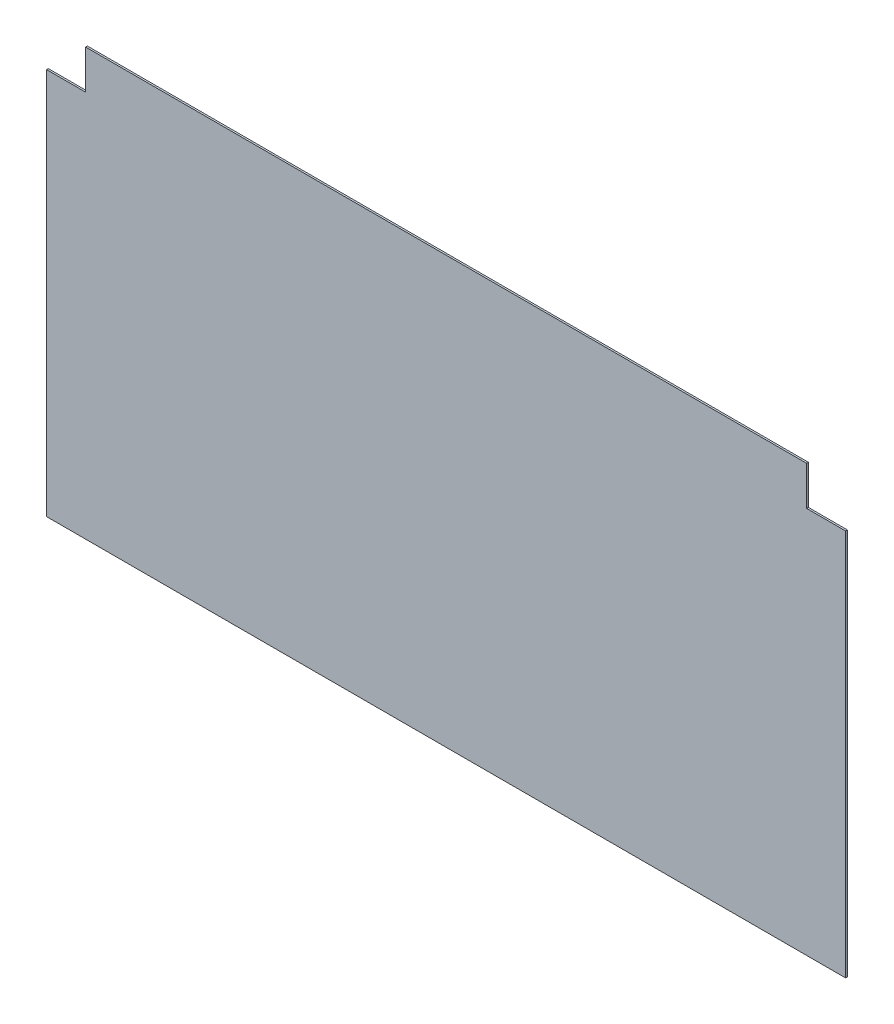
ISO-10303-21;
HEADER;
FILE_DESCRIPTION(('STEP AP214'),'2;1');
FILE_NAME('part.step','',(''),(''),'','','');
FILE_SCHEMA(('AUTOMOTIVE_DESIGN { 1 0 10303 214 1 1 1 1 }'));
ENDSEC;
DATA;
#1=APPLICATION_CONTEXT('core data for automotive mechanical design processes');
#2=APPLICATION_PROTOCOL_DEFINITION('international standard','automotive_design',2000,#1);
#3=PRODUCT_CONTEXT('',#1,'mechanical');
#4=PRODUCT('Part','Part','',(#3));
#5=PRODUCT_RELATED_PRODUCT_CATEGORY('part','',(#4));
#6=PRODUCT_DEFINITION_FORMATION('','',#4);
#7=PRODUCT_DEFINITION_CONTEXT('part definition',#1,'design');
#8=PRODUCT_DEFINITION('design','',#6,#7);
#9=PRODUCT_DEFINITION_SHAPE('','',#8);
#10=(LENGTH_UNIT() NAMED_UNIT(*) SI_UNIT(.MILLI.,.METRE.));
#11=(NAMED_UNIT(*) PLANE_ANGLE_UNIT() SI_UNIT($,.RADIAN.));
#12=(NAMED_UNIT(*) SI_UNIT($,.STERADIAN.) SOLID_ANGLE_UNIT());
#13=UNCERTAINTY_MEASURE_WITH_UNIT(LENGTH_MEASURE(1.E-05),#10,'distance_accuracy_value','');
#14=(GEOMETRIC_REPRESENTATION_CONTEXT(3) GLOBAL_UNCERTAINTY_ASSIGNED_CONTEXT((#13)) GLOBAL_UNIT_ASSIGNED_CONTEXT((#10,
#11,#12)) REPRESENTATION_CONTEXT('',''));
#15=CARTESIAN_POINT('',(0.,0.,0.));
#16=DIRECTION('',(0.,0.,1.));
#17=DIRECTION('',(1.,0.,0.));
#18=AXIS2_PLACEMENT_3D('',#15,#16,#17);
#19=CARTESIAN_POINT('',(225.,120.,1.));
#20=DIRECTION('',(-1.,0.,0.));
#21=DIRECTION('',(0.,-1.,0.));
#22=AXIS2_PLACEMENT_3D('',#19,#20,#21);
#23=PLANE('',#22);
#24=DIRECTION('',(0.,1.,0.));
#25=VECTOR('',#24,1.);
#26=CARTESIAN_POINT('',(225.,120.,0.));
#27=LINE('',#26,#25);
#28=CARTESIAN_POINT('',(225.,-120.,0.));
#29=VERTEX_POINT('',#28);
#30=CARTESIAN_POINT('',(225.,97.9999999999999,0.));
#31=VERTEX_POINT('',#30);
#32=EDGE_CURVE('E143',#29,#31,#27,.T.);
#33=ORIENTED_EDGE('',*,*,#32,.T.);
#34=DIRECTION('',(0.,0.,1.));
#35=VECTOR('',#34,1.);
#36=CARTESIAN_POINT('',(225.,97.9999999999999,-9.));
#37=LINE('',#36,#35);
#38=CARTESIAN_POINT('',(225.,97.9999999999999,1.));
#39=VERTEX_POINT('',#38);
#40=EDGE_CURVE('E193',#31,#39,#37,.T.);
#41=ORIENTED_EDGE('',*,*,#40,.T.);
#42=DIRECTION('',(0.,1.,0.));
#43=VECTOR('',#42,1.);
#44=CARTESIAN_POINT('',(225.,120.,1.));
#45=LINE('',#44,#43);
#46=CARTESIAN_POINT('',(225.,-120.,1.));
#47=VERTEX_POINT('',#46);
#48=EDGE_CURVE('E139',#47,#39,#45,.T.);
#49=ORIENTED_EDGE('',*,*,#48,.F.);
#50=DIRECTION('',(0.,0.,-1.));
#51=VECTOR('',#50,1.);
#52=CARTESIAN_POINT('',(225.,-120.,1.));
#53=LINE('',#52,#51);
#54=EDGE_CURVE('E137',#47,#29,#53,.T.);
#55=ORIENTED_EDGE('',*,*,#54,.T.);
#56=EDGE_LOOP('',(#33,#41,#49,#55));
#57=FACE_BOUND('',#56,.T.);
#58=ADVANCED_FACE('F44',(#57),#23,.F.);
#59=CARTESIAN_POINT('',(-225.,120.,1.));
#60=DIRECTION('',(0.,-1.,0.));
#61=DIRECTION('',(0.,0.,-1.));
#62=AXIS2_PLACEMENT_3D('',#59,#60,#61);
#63=PLANE('',#62);
#64=DIRECTION('',(-1.,0.,0.));
#65=VECTOR('',#64,1.);
#66=CARTESIAN_POINT('',(-225.,120.,0.));
#67=LINE('',#66,#65);
#68=CARTESIAN_POINT('',(203.,120.,0.));
#69=VERTEX_POINT('',#68);
#70=CARTESIAN_POINT('',(-203.,120.,0.));
#71=VERTEX_POINT('',#70);
#72=EDGE_CURVE('E147',#69,#71,#67,.T.);
#73=ORIENTED_EDGE('',*,*,#72,.T.);
#74=DIRECTION('',(0.,0.,1.));
#75=VECTOR('',#74,1.);
#76=CARTESIAN_POINT('',(-203.,120.,-9.));
#77=LINE('',#76,#75);
#78=CARTESIAN_POINT('',(-203.,120.,1.));
#79=VERTEX_POINT('',#78);
#80=EDGE_CURVE('E148',#71,#79,#77,.T.);
#81=ORIENTED_EDGE('',*,*,#80,.T.);
#82=DIRECTION('',(-1.,0.,0.));
#83=VECTOR('',#82,1.);
#84=CARTESIAN_POINT('',(-225.,120.,1.));
#85=LINE('',#84,#83);
#86=CARTESIAN_POINT('',(203.,120.,1.));
#87=VERTEX_POINT('',#86);
#88=EDGE_CURVE('E133',#87,#79,#85,.T.);
#89=ORIENTED_EDGE('',*,*,#88,.F.);
#90=DIRECTION('',(0.,0.,1.));
#91=VECTOR('',#90,1.);
#92=CARTESIAN_POINT('',(203.,120.,-9.));
#93=LINE('',#92,#91);
#94=EDGE_CURVE('E192',#69,#87,#93,.T.);
#95=ORIENTED_EDGE('',*,*,#94,.F.);
#96=EDGE_LOOP('',(#73,#81,#89,#95));
#97=FACE_BOUND('',#96,.T.);
#98=ADVANCED_FACE('F210',(#97),#63,.F.);
#99=CARTESIAN_POINT('',(-225.,120.,1.));
#100=DIRECTION('',(1.,0.,0.));
#101=DIRECTION('',(0.,1.,0.));
#102=AXIS2_PLACEMENT_3D('',#99,#100,#101);
#103=PLANE('',#102);
#104=DIRECTION('',(0.,-1.,0.));
#105=VECTOR('',#104,1.);
#106=CARTESIAN_POINT('',(-225.,120.,1.));
#107=LINE('',#106,#105);
#108=CARTESIAN_POINT('',(-225.,97.9999999999999,1.));
#109=VERTEX_POINT('',#108);
#110=CARTESIAN_POINT('',(-225.,-120.,1.));
#111=VERTEX_POINT('',#110);
#112=EDGE_CURVE('E121',#109,#111,#107,.T.);
#113=ORIENTED_EDGE('',*,*,#112,.F.);
#114=DIRECTION('',(0.,0.,1.));
#115=VECTOR('',#114,1.);
#116=CARTESIAN_POINT('',(-225.,97.9999999999999,-9.));
#117=LINE('',#116,#115);
#118=CARTESIAN_POINT('',(-225.,97.9999999999999,0.));
#119=VERTEX_POINT('',#118);
#120=EDGE_CURVE('E107',#119,#109,#117,.T.);
#121=ORIENTED_EDGE('',*,*,#120,.F.);
#122=DIRECTION('',(0.,-1.,0.));
#123=VECTOR('',#122,1.);
#124=CARTESIAN_POINT('',(-225.,120.,0.));
#125=LINE('',#124,#123);
#126=CARTESIAN_POINT('',(-225.,-120.,0.));
#127=VERTEX_POINT('',#126);
#128=EDGE_CURVE('E152',#119,#127,#125,.T.);
#129=ORIENTED_EDGE('',*,*,#128,.T.);
#130=DIRECTION('',(0.,0.,-1.));
#131=VECTOR('',#130,1.);
#132=CARTESIAN_POINT('',(-225.,-120.,1.));
#133=LINE('',#132,#131);
#134=EDGE_CURVE('E129',#111,#127,#133,.T.);
#135=ORIENTED_EDGE('',*,*,#134,.F.);
#136=EDGE_LOOP('',(#113,#121,#129,#135));
#137=FACE_BOUND('',#136,.T.);
#138=ADVANCED_FACE('F127',(#137),#103,.F.);
#139=CARTESIAN_POINT('',(-225.,-120.,1.));
#140=DIRECTION('',(0.,1.,0.));
#141=DIRECTION('',(0.,0.,1.));
#142=AXIS2_PLACEMENT_3D('',#139,#140,#141);
#143=PLANE('',#142);
#144=DIRECTION('',(1.,0.,0.));
#145=VECTOR('',#144,1.);
#146=CARTESIAN_POINT('',(-225.,-120.,0.));
#147=LINE('',#146,#145);
#148=EDGE_CURVE('E155',#127,#29,#147,.T.);
#149=ORIENTED_EDGE('',*,*,#148,.T.);
#150=ORIENTED_EDGE('',*,*,#54,.F.);
#151=DIRECTION('',(1.,0.,0.));
#152=VECTOR('',#151,1.);
#153=CARTESIAN_POINT('',(-225.,-120.,1.));
#154=LINE('',#153,#152);
#155=EDGE_CURVE('E132',#111,#47,#154,.T.);
#156=ORIENTED_EDGE('',*,*,#155,.F.);
#157=ORIENTED_EDGE('',*,*,#134,.T.);
#158=EDGE_LOOP('',(#149,#150,#156,#157));
#159=FACE_BOUND('',#158,.T.);
#160=ADVANCED_FACE('F177',(#159),#143,.F.);
#161=CARTESIAN_POINT('',(0.,0.,1.));
#162=DIRECTION('',(0.,0.,1.));
#163=DIRECTION('',(1.,0.,0.));
#164=AXIS2_PLACEMENT_3D('',#161,#162,#163);
#165=PLANE('',#164);
#166=DIRECTION('',(0.,1.,0.));
#167=VECTOR('',#166,1.);
#168=CARTESIAN_POINT('',(-203.,120.,1.));
#169=LINE('',#168,#167);
#170=CARTESIAN_POINT('',(-203.,97.9999999999999,1.));
#171=VERTEX_POINT('',#170);
#172=EDGE_CURVE('E117',#171,#79,#169,.T.);
#173=ORIENTED_EDGE('',*,*,#172,.F.);
#174=DIRECTION('',(1.,0.,0.));
#175=VECTOR('',#174,1.);
#176=CARTESIAN_POINT('',(-225.,97.9999999999999,1.));
#177=LINE('',#176,#175);
#178=EDGE_CURVE('E110',#109,#171,#177,.T.);
#179=ORIENTED_EDGE('',*,*,#178,.F.);
#180=ORIENTED_EDGE('',*,*,#112,.T.);
#181=ORIENTED_EDGE('',*,*,#155,.T.);
#182=ORIENTED_EDGE('',*,*,#48,.T.);
#183=DIRECTION('',(1.,0.,0.));
#184=VECTOR('',#183,1.);
#185=CARTESIAN_POINT('',(225.,97.9999999999999,1.));
#186=LINE('',#185,#184);
#187=CARTESIAN_POINT('',(203.,97.9999999999999,1.));
#188=VERTEX_POINT('',#187);
#189=EDGE_CURVE('E183',#188,#39,#186,.T.);
#190=ORIENTED_EDGE('',*,*,#189,.F.);
#191=DIRECTION('',(0.,-1.,0.));
#192=VECTOR('',#191,1.);
#193=CARTESIAN_POINT('',(203.,120.,1.));
#194=LINE('',#193,#192);
#195=EDGE_CURVE('E125',#87,#188,#194,.T.);
#196=ORIENTED_EDGE('',*,*,#195,.F.);
#197=ORIENTED_EDGE('',*,*,#88,.T.);
#198=EDGE_LOOP('',(#173,#179,#180,#181,#182,#190,#196,#197));
#199=FACE_BOUND('',#198,.T.);
#200=ADVANCED_FACE('F120',(#199),#165,.T.);
#201=CARTESIAN_POINT('',(0.,0.,0.));
#202=DIRECTION('',(0.,0.,1.));
#203=DIRECTION('',(1.,0.,0.));
#204=AXIS2_PLACEMENT_3D('',#201,#202,#203);
#205=PLANE('',#204);
#206=DIRECTION('',(1.,0.,0.));
#207=VECTOR('',#206,1.);
#208=CARTESIAN_POINT('',(0.,97.9999999999999,0.));
#209=LINE('',#208,#207);
#210=CARTESIAN_POINT('',(-203.,97.9999999999999,0.));
#211=VERTEX_POINT('',#210);
#212=EDGE_CURVE('E52',#119,#211,#209,.T.);
#213=ORIENTED_EDGE('',*,*,#212,.T.);
#214=DIRECTION('',(0.,1.,0.));
#215=VECTOR('',#214,1.);
#216=CARTESIAN_POINT('',(-203.,-2.56108265907848E-13,0.));
#217=LINE('',#216,#215);
#218=EDGE_CURVE('E11',#211,#71,#217,.T.);
#219=ORIENTED_EDGE('',*,*,#218,.T.);
#220=ORIENTED_EDGE('',*,*,#72,.F.);
#221=DIRECTION('',(0.,-1.,0.));
#222=VECTOR('',#221,1.);
#223=CARTESIAN_POINT('',(203.,5.12216531815698E-13,0.));
#224=LINE('',#223,#222);
#225=CARTESIAN_POINT('',(203.,97.9999999999999,0.));
#226=VERTEX_POINT('',#225);
#227=EDGE_CURVE('E163',#69,#226,#224,.T.);
#228=ORIENTED_EDGE('',*,*,#227,.T.);
#229=DIRECTION('',(1.,0.,0.));
#230=VECTOR('',#229,1.);
#231=CARTESIAN_POINT('',(0.,97.9999999999999,0.));
#232=LINE('',#231,#230);
#233=EDGE_CURVE('E167',#226,#31,#232,.T.);
#234=ORIENTED_EDGE('',*,*,#233,.T.);
#235=ORIENTED_EDGE('',*,*,#32,.F.);
#236=ORIENTED_EDGE('',*,*,#148,.F.);
#237=ORIENTED_EDGE('',*,*,#128,.F.);
#238=EDGE_LOOP('',(#213,#219,#220,#228,#234,#235,#236,#237));
#239=FACE_BOUND('',#238,.T.);
#240=ADVANCED_FACE('F172',(#239),#205,.F.);
#241=CARTESIAN_POINT('',(225.,97.9999999999999,-9.));
#242=DIRECTION('',(0.,-1.,0.));
#243=DIRECTION('',(0.,0.,-1.));
#244=AXIS2_PLACEMENT_3D('',#241,#242,#243);
#245=PLANE('',#244);
#246=DIRECTION('',(0.,0.,1.));
#247=VECTOR('',#246,1.);
#248=CARTESIAN_POINT('',(203.,97.9999999999999,-9.));
#249=LINE('',#248,#247);
#250=EDGE_CURVE('E67',#226,#188,#249,.T.);
#251=ORIENTED_EDGE('',*,*,#250,.T.);
#252=ORIENTED_EDGE('',*,*,#189,.T.);
#253=ORIENTED_EDGE('',*,*,#40,.F.);
#254=ORIENTED_EDGE('',*,*,#233,.F.);
#255=EDGE_LOOP('',(#251,#252,#253,#254));
#256=FACE_BOUND('',#255,.T.);
#257=ADVANCED_FACE('F214',(#256),#245,.F.);
#258=CARTESIAN_POINT('',(203.,120.,-9.));
#259=DIRECTION('',(-1.,0.,0.));
#260=DIRECTION('',(0.,-1.,0.));
#261=AXIS2_PLACEMENT_3D('',#258,#259,#260);
#262=PLANE('',#261);
#263=ORIENTED_EDGE('',*,*,#94,.T.);
#264=ORIENTED_EDGE('',*,*,#195,.T.);
#265=ORIENTED_EDGE('',*,*,#250,.F.);
#266=ORIENTED_EDGE('',*,*,#227,.F.);
#267=EDGE_LOOP('',(#263,#264,#265,#266));
#268=FACE_BOUND('',#267,.T.);
#269=ADVANCED_FACE('F212',(#268),#262,.F.);
#270=CARTESIAN_POINT('',(-203.,120.,-9.));
#271=DIRECTION('',(1.,0.,0.));
#272=DIRECTION('',(0.,1.,0.));
#273=AXIS2_PLACEMENT_3D('',#270,#271,#272);
#274=PLANE('',#273);
#275=DIRECTION('',(0.,0.,1.));
#276=VECTOR('',#275,1.);
#277=CARTESIAN_POINT('',(-203.,97.9999999999999,-9.));
#278=LINE('',#277,#276);
#279=EDGE_CURVE('E59',#211,#171,#278,.T.);
#280=ORIENTED_EDGE('',*,*,#279,.T.);
#281=ORIENTED_EDGE('',*,*,#172,.T.);
#282=ORIENTED_EDGE('',*,*,#80,.F.);
#283=ORIENTED_EDGE('',*,*,#218,.F.);
#284=EDGE_LOOP('',(#280,#281,#282,#283));
#285=FACE_BOUND('',#284,.T.);
#286=ADVANCED_FACE('F207',(#285),#274,.F.);
#287=CARTESIAN_POINT('',(-225.,97.9999999999999,-9.));
#288=DIRECTION('',(0.,-1.,0.));
#289=DIRECTION('',(0.,0.,-1.));
#290=AXIS2_PLACEMENT_3D('',#287,#288,#289);
#291=PLANE('',#290);
#292=ORIENTED_EDGE('',*,*,#120,.T.);
#293=ORIENTED_EDGE('',*,*,#178,.T.);
#294=ORIENTED_EDGE('',*,*,#279,.F.);
#295=ORIENTED_EDGE('',*,*,#212,.F.);
#296=EDGE_LOOP('',(#292,#293,#294,#295));
#297=FACE_BOUND('',#296,.T.);
#298=ADVANCED_FACE('F109',(#297),#291,.F.);
#299=CLOSED_SHELL('',(#58,#98,#138,#160,#200,#240,#257,#269,#286,#298));
#300=MANIFOLD_SOLID_BREP('B2',#299);
#301=ADVANCED_BREP_SHAPE_REPRESENTATION('',(#18,#300),#14);
#302=SHAPE_DEFINITION_REPRESENTATION(#9,#301);
ENDSEC;
END-ISO-10303-21;
